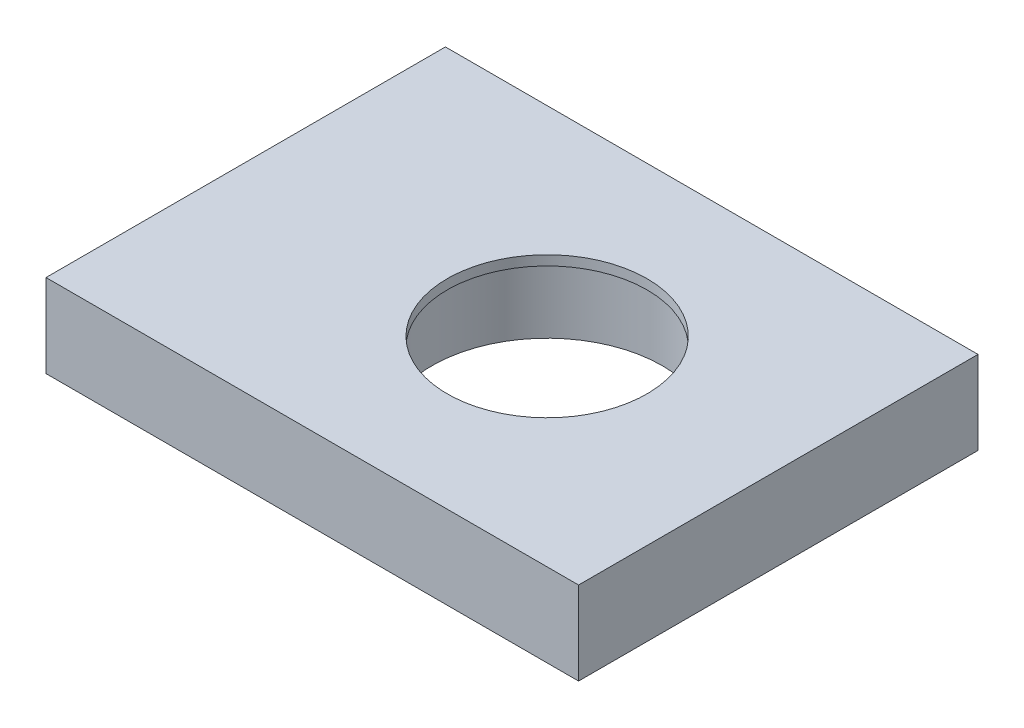
ISO-10303-21;
HEADER;
FILE_DESCRIPTION(('STEP AP214'),'2;1');
FILE_NAME('part.step','',(''),(''),'','','');
FILE_SCHEMA(('AUTOMOTIVE_DESIGN { 1 0 10303 214 1 1 1 1 }'));
ENDSEC;
DATA;
#1=APPLICATION_CONTEXT('core data for automotive mechanical design processes');
#2=APPLICATION_PROTOCOL_DEFINITION('international standard','automotive_design',2000,#1);
#3=PRODUCT_CONTEXT('',#1,'mechanical');
#4=PRODUCT('Part','Part','',(#3));
#5=PRODUCT_RELATED_PRODUCT_CATEGORY('part','',(#4));
#6=PRODUCT_DEFINITION_FORMATION('','',#4);
#7=PRODUCT_DEFINITION_CONTEXT('part definition',#1,'design');
#8=PRODUCT_DEFINITION('design','',#6,#7);
#9=PRODUCT_DEFINITION_SHAPE('','',#8);
#10=(LENGTH_UNIT() NAMED_UNIT(*) SI_UNIT(.MILLI.,.METRE.));
#11=(NAMED_UNIT(*) PLANE_ANGLE_UNIT() SI_UNIT($,.RADIAN.));
#12=(NAMED_UNIT(*) SI_UNIT($,.STERADIAN.) SOLID_ANGLE_UNIT());
#13=UNCERTAINTY_MEASURE_WITH_UNIT(LENGTH_MEASURE(1.E-05),#10,'distance_accuracy_value','');
#14=(GEOMETRIC_REPRESENTATION_CONTEXT(3) GLOBAL_UNCERTAINTY_ASSIGNED_CONTEXT((#13)) GLOBAL_UNIT_ASSIGNED_CONTEXT((#10,
#11,#12)) REPRESENTATION_CONTEXT('',''));
#15=CARTESIAN_POINT('',(0.,0.,0.));
#16=DIRECTION('',(0.,0.,1.));
#17=DIRECTION('',(1.,0.,0.));
#18=AXIS2_PLACEMENT_3D('',#15,#16,#17);
#19=CARTESIAN_POINT('',(3.35279999999999,7.9375,0.));
#20=DIRECTION('',(0.,-1.,0.));
#21=DIRECTION('',(0.,0.,-1.));
#22=AXIS2_PLACEMENT_3D('',#19,#20,#21);
#23=CYLINDRICAL_SURFACE('',#22,9.525);
#24=CARTESIAN_POINT('',(3.35279999999999,7.9375,0.));
#25=DIRECTION('',(0.,-1.,0.));
#26=DIRECTION('',(0.,0.,-1.));
#27=AXIS2_PLACEMENT_3D('',#24,#25,#26);
#28=CIRCLE('',#27,9.525);
#29=CARTESIAN_POINT('',(3.35279999999999,7.9375,-9.525));
#30=VERTEX_POINT('',#29);
#31=EDGE_CURVE('E110',#30,#30,#28,.T.);
#32=ORIENTED_EDGE('',*,*,#31,.F.);
#33=EDGE_LOOP('',(#32));
#34=FACE_BOUND('',#33,.T.);
#35=CARTESIAN_POINT('',(3.35279999999999,7.0104,0.));
#36=DIRECTION('',(0.,-1.,0.));
#37=DIRECTION('',(0.,0.,-1.));
#38=AXIS2_PLACEMENT_3D('',#35,#36,#37);
#39=CIRCLE('',#38,9.525);
#40=CARTESIAN_POINT('',(3.35279999999999,7.0104,-9.525));
#41=VERTEX_POINT('',#40);
#42=EDGE_CURVE('E45',#41,#41,#39,.F.);
#43=ORIENTED_EDGE('',*,*,#42,.F.);
#44=EDGE_LOOP('',(#43));
#45=FACE_BOUND('',#44,.T.);
#46=ADVANCED_FACE('F41',(#34,#45),#23,.F.);
#47=CARTESIAN_POINT('',(25.4,7.9375,19.05));
#48=DIRECTION('',(-1.,0.,0.));
#49=DIRECTION('',(0.,0.,1.));
#50=AXIS2_PLACEMENT_3D('',#47,#48,#49);
#51=PLANE('',#50);
#52=DIRECTION('',(0.,0.,-1.));
#53=VECTOR('',#52,1.);
#54=CARTESIAN_POINT('',(25.4,0.,19.05));
#55=LINE('',#54,#53);
#56=CARTESIAN_POINT('',(25.4,0.,19.05));
#57=VERTEX_POINT('',#56);
#58=CARTESIAN_POINT('',(25.4,0.,-19.05));
#59=VERTEX_POINT('',#58);
#60=EDGE_CURVE('E107',#57,#59,#55,.T.);
#61=ORIENTED_EDGE('',*,*,#60,.T.);
#62=DIRECTION('',(0.,-1.,0.));
#63=VECTOR('',#62,1.);
#64=CARTESIAN_POINT('',(25.4,7.9375,-19.05));
#65=LINE('',#64,#63);
#66=CARTESIAN_POINT('',(25.4,7.9375,-19.05));
#67=VERTEX_POINT('',#66);
#68=EDGE_CURVE('E11',#67,#59,#65,.T.);
#69=ORIENTED_EDGE('',*,*,#68,.F.);
#70=DIRECTION('',(0.,0.,-1.));
#71=VECTOR('',#70,1.);
#72=CARTESIAN_POINT('',(25.4,7.9375,19.05));
#73=LINE('',#72,#71);
#74=CARTESIAN_POINT('',(25.4,7.9375,19.05));
#75=VERTEX_POINT('',#74);
#76=EDGE_CURVE('E94',#75,#67,#73,.T.);
#77=ORIENTED_EDGE('',*,*,#76,.F.);
#78=DIRECTION('',(0.,-1.,0.));
#79=VECTOR('',#78,1.);
#80=CARTESIAN_POINT('',(25.4,7.9375,19.05));
#81=LINE('',#80,#79);
#82=EDGE_CURVE('E103',#75,#57,#81,.T.);
#83=ORIENTED_EDGE('',*,*,#82,.T.);
#84=EDGE_LOOP('',(#61,#69,#77,#83));
#85=FACE_BOUND('',#84,.T.);
#86=ADVANCED_FACE('F43',(#85),#51,.F.);
#87=CARTESIAN_POINT('',(-25.4,7.9375,-19.05));
#88=DIRECTION('',(0.,0.,1.));
#89=DIRECTION('',(1.,0.,0.));
#90=AXIS2_PLACEMENT_3D('',#87,#88,#89);
#91=PLANE('',#90);
#92=DIRECTION('',(-1.,0.,0.));
#93=VECTOR('',#92,1.);
#94=CARTESIAN_POINT('',(-25.4,0.,-19.05));
#95=LINE('',#94,#93);
#96=CARTESIAN_POINT('',(-25.4,0.,-19.05));
#97=VERTEX_POINT('',#96);
#98=EDGE_CURVE('E98',#59,#97,#95,.T.);
#99=ORIENTED_EDGE('',*,*,#98,.T.);
#100=DIRECTION('',(0.,-1.,0.));
#101=VECTOR('',#100,1.);
#102=CARTESIAN_POINT('',(-25.4,7.9375,-19.05));
#103=LINE('',#102,#101);
#104=CARTESIAN_POINT('',(-25.4,7.9375,-19.05));
#105=VERTEX_POINT('',#104);
#106=EDGE_CURVE('E51',#105,#97,#103,.T.);
#107=ORIENTED_EDGE('',*,*,#106,.F.);
#108=DIRECTION('',(-1.,0.,0.));
#109=VECTOR('',#108,1.);
#110=CARTESIAN_POINT('',(-25.4,7.9375,-19.05));
#111=LINE('',#110,#109);
#112=EDGE_CURVE('E89',#67,#105,#111,.T.);
#113=ORIENTED_EDGE('',*,*,#112,.F.);
#114=ORIENTED_EDGE('',*,*,#68,.T.);
#115=EDGE_LOOP('',(#99,#107,#113,#114));
#116=FACE_BOUND('',#115,.T.);
#117=ADVANCED_FACE('F97',(#116),#91,.F.);
#118=CARTESIAN_POINT('',(-25.4,7.9375,19.05));
#119=DIRECTION('',(1.,0.,0.));
#120=DIRECTION('',(0.,0.,-1.));
#121=AXIS2_PLACEMENT_3D('',#118,#119,#120);
#122=PLANE('',#121);
#123=DIRECTION('',(0.,0.,1.));
#124=VECTOR('',#123,1.);
#125=CARTESIAN_POINT('',(-25.4,0.,19.05));
#126=LINE('',#125,#124);
#127=CARTESIAN_POINT('',(-25.4,0.,19.05));
#128=VERTEX_POINT('',#127);
#129=EDGE_CURVE('E76',#97,#128,#126,.T.);
#130=ORIENTED_EDGE('',*,*,#129,.T.);
#131=DIRECTION('',(0.,-1.,0.));
#132=VECTOR('',#131,1.);
#133=CARTESIAN_POINT('',(-25.4,7.9375,19.05));
#134=LINE('',#133,#132);
#135=CARTESIAN_POINT('',(-25.4,7.9375,19.05));
#136=VERTEX_POINT('',#135);
#137=EDGE_CURVE('E99',#136,#128,#134,.T.);
#138=ORIENTED_EDGE('',*,*,#137,.F.);
#139=DIRECTION('',(0.,0.,1.));
#140=VECTOR('',#139,1.);
#141=CARTESIAN_POINT('',(-25.4,7.9375,19.05));
#142=LINE('',#141,#140);
#143=EDGE_CURVE('E92',#105,#136,#142,.T.);
#144=ORIENTED_EDGE('',*,*,#143,.F.);
#145=ORIENTED_EDGE('',*,*,#106,.T.);
#146=EDGE_LOOP('',(#130,#138,#144,#145));
#147=FACE_BOUND('',#146,.T.);
#148=ADVANCED_FACE('F101',(#147),#122,.F.);
#149=CARTESIAN_POINT('',(-25.4,7.9375,19.05));
#150=DIRECTION('',(0.,0.,-1.));
#151=DIRECTION('',(-1.,0.,0.));
#152=AXIS2_PLACEMENT_3D('',#149,#150,#151);
#153=PLANE('',#152);
#154=DIRECTION('',(1.,0.,0.));
#155=VECTOR('',#154,1.);
#156=CARTESIAN_POINT('',(-25.4,0.,19.05));
#157=LINE('',#156,#155);
#158=EDGE_CURVE('E82',#128,#57,#157,.T.);
#159=ORIENTED_EDGE('',*,*,#158,.T.);
#160=ORIENTED_EDGE('',*,*,#82,.F.);
#161=DIRECTION('',(1.,0.,0.));
#162=VECTOR('',#161,1.);
#163=CARTESIAN_POINT('',(-25.4,7.9375,19.05));
#164=LINE('',#163,#162);
#165=EDGE_CURVE('E59',#136,#75,#164,.T.);
#166=ORIENTED_EDGE('',*,*,#165,.F.);
#167=ORIENTED_EDGE('',*,*,#137,.T.);
#168=EDGE_LOOP('',(#159,#160,#166,#167));
#169=FACE_BOUND('',#168,.T.);
#170=ADVANCED_FACE('F115',(#169),#153,.F.);
#171=CARTESIAN_POINT('',(0.,7.9375,0.));
#172=DIRECTION('',(0.,-1.,0.));
#173=DIRECTION('',(0.,0.,-1.));
#174=AXIS2_PLACEMENT_3D('',#171,#172,#173);
#175=PLANE('',#174);
#176=ORIENTED_EDGE('',*,*,#31,.T.);
#177=EDGE_LOOP('',(#176));
#178=FACE_BOUND('',#177,.T.);
#179=ORIENTED_EDGE('',*,*,#76,.T.);
#180=ORIENTED_EDGE('',*,*,#112,.T.);
#181=ORIENTED_EDGE('',*,*,#143,.T.);
#182=ORIENTED_EDGE('',*,*,#165,.T.);
#183=EDGE_LOOP('',(#179,#180,#181,#182));
#184=FACE_BOUND('',#183,.T.);
#185=ADVANCED_FACE('F90',(#178,#184),#175,.F.);
#186=CARTESIAN_POINT('',(0.,0.,0.));
#187=DIRECTION('',(0.,-1.,0.));
#188=DIRECTION('',(0.,0.,-1.));
#189=AXIS2_PLACEMENT_3D('',#186,#187,#188);
#190=PLANE('',#189);
#191=CARTESIAN_POINT('',(-21.4249,0.,14.986));
#192=DIRECTION('',(0.,-1.,0.));
#193=DIRECTION('',(0.,0.,-1.));
#194=AXIS2_PLACEMENT_3D('',#191,#192,#193);
#195=CIRCLE('',#194,1.4986);
#196=CARTESIAN_POINT('',(-21.4249,0.,13.4874));
#197=VERTEX_POINT('',#196);
#198=EDGE_CURVE('E143',#197,#197,#195,.T.);
#199=ORIENTED_EDGE('',*,*,#198,.F.);
#200=EDGE_LOOP('',(#199));
#201=FACE_BOUND('',#200,.T.);
#202=CARTESIAN_POINT('',(-21.4249,0.,-4.99533333333333));
#203=DIRECTION('',(0.,-1.,0.));
#204=DIRECTION('',(0.,0.,-1.));
#205=AXIS2_PLACEMENT_3D('',#202,#203,#204);
#206=CIRCLE('',#205,1.4986);
#207=CARTESIAN_POINT('',(-21.4249,0.,-6.49393333333333));
#208=VERTEX_POINT('',#207);
#209=EDGE_CURVE('E134',#208,#208,#206,.T.);
#210=ORIENTED_EDGE('',*,*,#209,.F.);
#211=EDGE_LOOP('',(#210));
#212=FACE_BOUND('',#211,.T.);
#213=CARTESIAN_POINT('',(-21.4249,0.,-14.986));
#214=DIRECTION('',(0.,-1.,0.));
#215=DIRECTION('',(0.,0.,-1.));
#216=AXIS2_PLACEMENT_3D('',#213,#214,#215);
#217=CIRCLE('',#216,1.4986);
#218=CARTESIAN_POINT('',(-21.4249,0.,-16.4846));
#219=VERTEX_POINT('',#218);
#220=EDGE_CURVE('E133',#219,#219,#217,.T.);
#221=ORIENTED_EDGE('',*,*,#220,.F.);
#222=EDGE_LOOP('',(#221));
#223=FACE_BOUND('',#222,.T.);
#224=CARTESIAN_POINT('',(-21.4249,0.,4.99533333333334));
#225=DIRECTION('',(0.,-1.,0.));
#226=DIRECTION('',(0.,0.,-1.));
#227=AXIS2_PLACEMENT_3D('',#224,#225,#226);
#228=CIRCLE('',#227,1.4986);
#229=CARTESIAN_POINT('',(-21.4249,0.,3.49673333333334));
#230=VERTEX_POINT('',#229);
#231=EDGE_CURVE('E140',#230,#230,#228,.T.);
#232=ORIENTED_EDGE('',*,*,#231,.F.);
#233=EDGE_LOOP('',(#232));
#234=FACE_BOUND('',#233,.T.);
#235=CARTESIAN_POINT('',(3.35279999999999,0.,0.));
#236=DIRECTION('',(0.,-1.,0.));
#237=DIRECTION('',(0.,0.,-1.));
#238=AXIS2_PLACEMENT_3D('',#235,#236,#237);
#239=CIRCLE('',#238,10.9982);
#240=CARTESIAN_POINT('',(3.35279999999999,0.,-10.9982));
#241=VERTEX_POINT('',#240);
#242=EDGE_CURVE('E123',#241,#241,#239,.T.);
#243=ORIENTED_EDGE('',*,*,#242,.F.);
#244=EDGE_LOOP('',(#243));
#245=FACE_BOUND('',#244,.T.);
#246=ORIENTED_EDGE('',*,*,#60,.F.);
#247=ORIENTED_EDGE('',*,*,#158,.F.);
#248=ORIENTED_EDGE('',*,*,#129,.F.);
#249=ORIENTED_EDGE('',*,*,#98,.F.);
#250=EDGE_LOOP('',(#246,#247,#248,#249));
#251=FACE_BOUND('',#250,.T.);
#252=ADVANCED_FACE('F118',(#201,#212,#223,#234,#245,#251),#190,.T.);
#253=CARTESIAN_POINT('',(3.35279999999999,7.0104,0.));
#254=DIRECTION('',(0.,-1.,0.));
#255=DIRECTION('',(0.,0.,-1.));
#256=AXIS2_PLACEMENT_3D('',#253,#254,#255);
#257=PLANE('',#256);
#258=CARTESIAN_POINT('',(3.35279999999999,7.0104,0.));
#259=DIRECTION('',(0.,-1.,0.));
#260=DIRECTION('',(0.,0.,-1.));
#261=AXIS2_PLACEMENT_3D('',#258,#259,#260);
#262=CIRCLE('',#261,10.9982);
#263=CARTESIAN_POINT('',(3.35279999999999,7.0104,-10.9982));
#264=VERTEX_POINT('',#263);
#265=EDGE_CURVE('E126',#264,#264,#262,.T.);
#266=ORIENTED_EDGE('',*,*,#265,.T.);
#267=EDGE_LOOP('',(#266));
#268=FACE_BOUND('',#267,.T.);
#269=ORIENTED_EDGE('',*,*,#42,.T.);
#270=EDGE_LOOP('',(#269));
#271=FACE_BOUND('',#270,.T.);
#272=ADVANCED_FACE('F165',(#268,#271),#257,.T.);
#273=CARTESIAN_POINT('',(3.35279999999999,7.0104,0.));
#274=DIRECTION('',(0.,-1.,0.));
#275=DIRECTION('',(0.,0.,-1.));
#276=AXIS2_PLACEMENT_3D('',#273,#274,#275);
#277=CYLINDRICAL_SURFACE('',#276,10.9982);
#278=ORIENTED_EDGE('',*,*,#265,.F.);
#279=EDGE_LOOP('',(#278));
#280=FACE_BOUND('',#279,.T.);
#281=ORIENTED_EDGE('',*,*,#242,.T.);
#282=EDGE_LOOP('',(#281));
#283=FACE_BOUND('',#282,.T.);
#284=ADVANCED_FACE('F175',(#280,#283),#277,.F.);
#285=CARTESIAN_POINT('',(-21.4249,6.5,4.99533333333334));
#286=DIRECTION('',(0.,-1.,0.));
#287=DIRECTION('',(0.,0.,-1.));
#288=AXIS2_PLACEMENT_3D('',#285,#286,#287);
#289=CYLINDRICAL_SURFACE('',#288,1.4986);
#290=CARTESIAN_POINT('',(-21.4249,6.5,4.99533333333334));
#291=DIRECTION('',(0.,-1.,0.));
#292=DIRECTION('',(0.,0.,-1.));
#293=AXIS2_PLACEMENT_3D('',#290,#291,#292);
#294=CIRCLE('',#293,1.4986);
#295=CARTESIAN_POINT('',(-21.4249,6.5,3.49673333333334));
#296=VERTEX_POINT('',#295);
#297=EDGE_CURVE('E137',#296,#296,#294,.T.);
#298=CARTESIAN_POINT('',(-21.4249,6.5,3.49673333333334));
#299=CARTESIAN_POINT('',(-21.4249,6.43229166666667,3.49673333333334));
#300=CARTESIAN_POINT('',(-21.4249,6.36458333333333,3.49673333333334));
#301=CARTESIAN_POINT('',(-21.4249,6.22916666666667,3.49673333333334));
#302=CARTESIAN_POINT('',(-21.4249,6.16145833333333,3.49673333333334));
#303=CARTESIAN_POINT('',(-21.4249,6.02604166666667,3.49673333333334));
#304=CARTESIAN_POINT('',(-21.4249,5.95833333333333,3.49673333333334));
#305=CARTESIAN_POINT('',(-21.4249,5.82291666666667,3.49673333333334));
#306=CARTESIAN_POINT('',(-21.4249,5.75520833333333,3.49673333333334));
#307=CARTESIAN_POINT('',(-21.4249,5.61979166666667,3.49673333333334));
#308=CARTESIAN_POINT('',(-21.4249,5.55208333333333,3.49673333333334));
#309=CARTESIAN_POINT('',(-21.4249,5.41666666666667,3.49673333333334));
#310=CARTESIAN_POINT('',(-21.4249,5.34895833333333,3.49673333333334));
#311=CARTESIAN_POINT('',(-21.4249,5.21354166666667,3.49673333333334));
#312=CARTESIAN_POINT('',(-21.4249,5.14583333333333,3.49673333333334));
#313=CARTESIAN_POINT('',(-21.4249,5.01041666666667,3.49673333333334));
#314=CARTESIAN_POINT('',(-21.4249,4.94270833333333,3.49673333333334));
#315=CARTESIAN_POINT('',(-21.4249,4.80729166666667,3.49673333333334));
#316=CARTESIAN_POINT('',(-21.4249,4.73958333333333,3.49673333333334));
#317=CARTESIAN_POINT('',(-21.4249,4.60416666666667,3.49673333333334));
#318=CARTESIAN_POINT('',(-21.4249,4.53645833333333,3.49673333333334));
#319=CARTESIAN_POINT('',(-21.4249,4.40104166666667,3.49673333333334));
#320=CARTESIAN_POINT('',(-21.4249,4.33333333333333,3.49673333333334));
#321=CARTESIAN_POINT('',(-21.4249,4.19791666666667,3.49673333333334));
#322=CARTESIAN_POINT('',(-21.4249,4.13020833333333,3.49673333333334));
#323=CARTESIAN_POINT('',(-21.4249,3.99479166666667,3.49673333333334));
#324=CARTESIAN_POINT('',(-21.4249,3.92708333333333,3.49673333333334));
#325=CARTESIAN_POINT('',(-21.4249,3.79166666666667,3.49673333333334));
#326=CARTESIAN_POINT('',(-21.4249,3.72395833333333,3.49673333333334));
#327=CARTESIAN_POINT('',(-21.4249,3.58854166666667,3.49673333333334));
#328=CARTESIAN_POINT('',(-21.4249,3.52083333333333,3.49673333333334));
#329=CARTESIAN_POINT('',(-21.4249,3.38541666666667,3.49673333333334));
#330=CARTESIAN_POINT('',(-21.4249,3.31770833333333,3.49673333333334));
#331=CARTESIAN_POINT('',(-21.4249,3.18229166666667,3.49673333333334));
#332=CARTESIAN_POINT('',(-21.4249,3.11458333333333,3.49673333333334));
#333=CARTESIAN_POINT('',(-21.4249,2.97916666666667,3.49673333333334));
#334=CARTESIAN_POINT('',(-21.4249,2.91145833333333,3.49673333333334));
#335=CARTESIAN_POINT('',(-21.4249,2.77604166666667,3.49673333333334));
#336=CARTESIAN_POINT('',(-21.4249,2.70833333333333,3.49673333333334));
#337=CARTESIAN_POINT('',(-21.4249,2.57291666666667,3.49673333333334));
#338=CARTESIAN_POINT('',(-21.4249,2.50520833333333,3.49673333333334));
#339=CARTESIAN_POINT('',(-21.4249,2.36979166666667,3.49673333333334));
#340=CARTESIAN_POINT('',(-21.4249,2.30208333333333,3.49673333333334));
#341=CARTESIAN_POINT('',(-21.4249,2.16666666666667,3.49673333333334));
#342=CARTESIAN_POINT('',(-21.4249,2.09895833333333,3.49673333333334));
#343=CARTESIAN_POINT('',(-21.4249,1.96354166666667,3.49673333333334));
#344=CARTESIAN_POINT('',(-21.4249,1.89583333333333,3.49673333333334));
#345=CARTESIAN_POINT('',(-21.4249,1.76041666666667,3.49673333333334));
#346=CARTESIAN_POINT('',(-21.4249,1.69270833333333,3.49673333333334));
#347=CARTESIAN_POINT('',(-21.4249,1.55729166666667,3.49673333333334));
#348=CARTESIAN_POINT('',(-21.4249,1.48958333333333,3.49673333333334));
#349=CARTESIAN_POINT('',(-21.4249,1.35416666666667,3.49673333333334));
#350=CARTESIAN_POINT('',(-21.4249,1.28645833333333,3.49673333333334));
#351=CARTESIAN_POINT('',(-21.4249,1.15104166666667,3.49673333333334));
#352=CARTESIAN_POINT('',(-21.4249,1.08333333333333,3.49673333333334));
#353=CARTESIAN_POINT('',(-21.4249,0.947916666666667,3.49673333333334));
#354=CARTESIAN_POINT('',(-21.4249,0.880208333333333,3.49673333333334));
#355=CARTESIAN_POINT('',(-21.4249,0.744791666666667,3.49673333333334));
#356=CARTESIAN_POINT('',(-21.4249,0.677083333333334,3.49673333333334));
#357=CARTESIAN_POINT('',(-21.4249,0.541666666666667,3.49673333333334));
#358=CARTESIAN_POINT('',(-21.4249,0.473958333333334,3.49673333333334));
#359=CARTESIAN_POINT('',(-21.4249,0.338541666666667,3.49673333333334));
#360=CARTESIAN_POINT('',(-21.4249,0.270833333333334,3.49673333333334));
#361=CARTESIAN_POINT('',(-21.4249,0.135416666666667,3.49673333333334));
#362=CARTESIAN_POINT('',(-21.4249,0.0677083333333333,3.49673333333334));
#363=CARTESIAN_POINT('',(-21.4249,0.,3.49673333333334));
#364=B_SPLINE_CURVE_WITH_KNOTS('',3,(#298,#299,#300,#301,#302,#303,#304,#305,#306,#307,#308,
#309,#310,#311,#312,#313,#314,#315,#316,#317,#318,#319,#320,#321,#322,#323,#324,#325,#326,#327,
#328,#329,#330,#331,#332,#333,#334,#335,#336,#337,#338,#339,#340,#341,#342,#343,#344,#345,#346,
#347,#348,#349,#350,#351,#352,#353,#354,#355,#356,#357,#358,#359,#360,#361,#362,#363),
.UNSPECIFIED.,.F.,.F.,(4,2,2,2,2,2,2,2,2,2,2,2,2,2,2,2,2,2,2,2,2,2,2,2,2,2,2,2,2,2,2,2,4),(0.,
0.203125,0.40625,0.609375000000001,0.812500000000001,1.015625,1.21875,1.421875,1.625,1.828125,
2.03125,2.234375,2.4375,2.640625,2.84375,3.046875,3.25,3.453125,3.65625,3.859375,4.0625,
4.265625,4.46875,4.671875,4.875,5.078125,5.28125,5.484375,5.6875,5.890625,6.09375,6.296875,6.5),.UNSPECIFIED.);
#365=EDGE_CURVE('BSEAM177',#296,#230,#364,.T.);
#366=ORIENTED_EDGE('',*,*,#297,.F.);
#367=ORIENTED_EDGE('',*,*,#231,.T.);
#368=ORIENTED_EDGE('',*,*,#365,.T.);
#369=ORIENTED_EDGE('',*,*,#365,.F.);
#370=EDGE_LOOP('',(#366,#368,#367,#369));
#371=FACE_BOUND('',#370,.T.);
#372=ADVANCED_FACE('F177',(#371),#289,.F.);
#373=CARTESIAN_POINT('',(-21.4249,6.5,4.99533333333334));
#374=DIRECTION('',(0.,-1.,0.));
#375=DIRECTION('',(0.,0.,-1.));
#376=AXIS2_PLACEMENT_3D('',#373,#374,#375);
#377=PLANE('',#376);
#378=ORIENTED_EDGE('',*,*,#297,.T.);
#379=EDGE_LOOP('',(#378));
#380=FACE_BOUND('',#379,.T.);
#381=ADVANCED_FACE('F184',(#380),#377,.T.);
#382=CARTESIAN_POINT('',(-21.4249,6.5,-14.986));
#383=DIRECTION('',(0.,-1.,0.));
#384=DIRECTION('',(0.,0.,-1.));
#385=AXIS2_PLACEMENT_3D('',#382,#383,#384);
#386=CYLINDRICAL_SURFACE('',#385,1.4986);
#387=CARTESIAN_POINT('',(-21.4249,6.5,-14.986));
#388=DIRECTION('',(0.,-1.,0.));
#389=DIRECTION('',(0.,0.,-1.));
#390=AXIS2_PLACEMENT_3D('',#387,#388,#389);
#391=CIRCLE('',#390,1.4986);
#392=CARTESIAN_POINT('',(-21.4249,6.5,-16.4846));
#393=VERTEX_POINT('',#392);
#394=EDGE_CURVE('E130',#393,#393,#391,.T.);
#395=CARTESIAN_POINT('',(-21.4249,6.5,-16.4846));
#396=CARTESIAN_POINT('',(-21.4249,6.43229166666667,-16.4846));
#397=CARTESIAN_POINT('',(-21.4249,6.36458333333333,-16.4846));
#398=CARTESIAN_POINT('',(-21.4249,6.22916666666667,-16.4846));
#399=CARTESIAN_POINT('',(-21.4249,6.16145833333333,-16.4846));
#400=CARTESIAN_POINT('',(-21.4249,6.02604166666667,-16.4846));
#401=CARTESIAN_POINT('',(-21.4249,5.95833333333333,-16.4846));
#402=CARTESIAN_POINT('',(-21.4249,5.82291666666667,-16.4846));
#403=CARTESIAN_POINT('',(-21.4249,5.75520833333333,-16.4846));
#404=CARTESIAN_POINT('',(-21.4249,5.61979166666667,-16.4846));
#405=CARTESIAN_POINT('',(-21.4249,5.55208333333333,-16.4846));
#406=CARTESIAN_POINT('',(-21.4249,5.41666666666667,-16.4846));
#407=CARTESIAN_POINT('',(-21.4249,5.34895833333333,-16.4846));
#408=CARTESIAN_POINT('',(-21.4249,5.21354166666667,-16.4846));
#409=CARTESIAN_POINT('',(-21.4249,5.14583333333333,-16.4846));
#410=CARTESIAN_POINT('',(-21.4249,5.01041666666667,-16.4846));
#411=CARTESIAN_POINT('',(-21.4249,4.94270833333333,-16.4846));
#412=CARTESIAN_POINT('',(-21.4249,4.80729166666667,-16.4846));
#413=CARTESIAN_POINT('',(-21.4249,4.73958333333333,-16.4846));
#414=CARTESIAN_POINT('',(-21.4249,4.60416666666667,-16.4846));
#415=CARTESIAN_POINT('',(-21.4249,4.53645833333333,-16.4846));
#416=CARTESIAN_POINT('',(-21.4249,4.40104166666667,-16.4846));
#417=CARTESIAN_POINT('',(-21.4249,4.33333333333333,-16.4846));
#418=CARTESIAN_POINT('',(-21.4249,4.19791666666667,-16.4846));
#419=CARTESIAN_POINT('',(-21.4249,4.13020833333333,-16.4846));
#420=CARTESIAN_POINT('',(-21.4249,3.99479166666667,-16.4846));
#421=CARTESIAN_POINT('',(-21.4249,3.92708333333333,-16.4846));
#422=CARTESIAN_POINT('',(-21.4249,3.79166666666667,-16.4846));
#423=CARTESIAN_POINT('',(-21.4249,3.72395833333333,-16.4846));
#424=CARTESIAN_POINT('',(-21.4249,3.58854166666667,-16.4846));
#425=CARTESIAN_POINT('',(-21.4249,3.52083333333333,-16.4846));
#426=CARTESIAN_POINT('',(-21.4249,3.38541666666667,-16.4846));
#427=CARTESIAN_POINT('',(-21.4249,3.31770833333333,-16.4846));
#428=CARTESIAN_POINT('',(-21.4249,3.18229166666667,-16.4846));
#429=CARTESIAN_POINT('',(-21.4249,3.11458333333333,-16.4846));
#430=CARTESIAN_POINT('',(-21.4249,2.97916666666667,-16.4846));
#431=CARTESIAN_POINT('',(-21.4249,2.91145833333333,-16.4846));
#432=CARTESIAN_POINT('',(-21.4249,2.77604166666667,-16.4846));
#433=CARTESIAN_POINT('',(-21.4249,2.70833333333333,-16.4846));
#434=CARTESIAN_POINT('',(-21.4249,2.57291666666667,-16.4846));
#435=CARTESIAN_POINT('',(-21.4249,2.50520833333333,-16.4846));
#436=CARTESIAN_POINT('',(-21.4249,2.36979166666667,-16.4846));
#437=CARTESIAN_POINT('',(-21.4249,2.30208333333333,-16.4846));
#438=CARTESIAN_POINT('',(-21.4249,2.16666666666667,-16.4846));
#439=CARTESIAN_POINT('',(-21.4249,2.09895833333333,-16.4846));
#440=CARTESIAN_POINT('',(-21.4249,1.96354166666667,-16.4846));
#441=CARTESIAN_POINT('',(-21.4249,1.89583333333333,-16.4846));
#442=CARTESIAN_POINT('',(-21.4249,1.76041666666667,-16.4846));
#443=CARTESIAN_POINT('',(-21.4249,1.69270833333333,-16.4846));
#444=CARTESIAN_POINT('',(-21.4249,1.55729166666667,-16.4846));
#445=CARTESIAN_POINT('',(-21.4249,1.48958333333333,-16.4846));
#446=CARTESIAN_POINT('',(-21.4249,1.35416666666667,-16.4846));
#447=CARTESIAN_POINT('',(-21.4249,1.28645833333333,-16.4846));
#448=CARTESIAN_POINT('',(-21.4249,1.15104166666667,-16.4846));
#449=CARTESIAN_POINT('',(-21.4249,1.08333333333333,-16.4846));
#450=CARTESIAN_POINT('',(-21.4249,0.947916666666667,-16.4846));
#451=CARTESIAN_POINT('',(-21.4249,0.880208333333333,-16.4846));
#452=CARTESIAN_POINT('',(-21.4249,0.744791666666667,-16.4846));
#453=CARTESIAN_POINT('',(-21.4249,0.677083333333334,-16.4846));
#454=CARTESIAN_POINT('',(-21.4249,0.541666666666667,-16.4846));
#455=CARTESIAN_POINT('',(-21.4249,0.473958333333334,-16.4846));
#456=CARTESIAN_POINT('',(-21.4249,0.338541666666667,-16.4846));
#457=CARTESIAN_POINT('',(-21.4249,0.270833333333334,-16.4846));
#458=CARTESIAN_POINT('',(-21.4249,0.135416666666667,-16.4846));
#459=CARTESIAN_POINT('',(-21.4249,0.0677083333333333,-16.4846));
#460=CARTESIAN_POINT('',(-21.4249,0.,-16.4846));
#461=B_SPLINE_CURVE_WITH_KNOTS('',3,(#395,#396,#397,#398,#399,#400,#401,#402,#403,#404,#405,
#406,#407,#408,#409,#410,#411,#412,#413,#414,#415,#416,#417,#418,#419,#420,#421,#422,#423,#424,
#425,#426,#427,#428,#429,#430,#431,#432,#433,#434,#435,#436,#437,#438,#439,#440,#441,#442,#443,
#444,#445,#446,#447,#448,#449,#450,#451,#452,#453,#454,#455,#456,#457,#458,#459,#460),
.UNSPECIFIED.,.F.,.F.,(4,2,2,2,2,2,2,2,2,2,2,2,2,2,2,2,2,2,2,2,2,2,2,2,2,2,2,2,2,2,2,2,4),(0.,
0.203125,0.40625,0.609375000000001,0.812500000000001,1.015625,1.21875,1.421875,1.625,1.828125,
2.03125,2.234375,2.4375,2.640625,2.84375,3.046875,3.25,3.453125,3.65625,3.859375,4.0625,
4.265625,4.46875,4.671875,4.875,5.078125,5.28125,5.484375,5.6875,5.890625,6.09375,6.296875,6.5),.UNSPECIFIED.);
#462=EDGE_CURVE('BSEAM261',#393,#219,#461,.T.);
#463=ORIENTED_EDGE('',*,*,#394,.F.);
#464=ORIENTED_EDGE('',*,*,#220,.T.);
#465=ORIENTED_EDGE('',*,*,#462,.T.);
#466=ORIENTED_EDGE('',*,*,#462,.F.);
#467=EDGE_LOOP('',(#463,#465,#464,#466));
#468=FACE_BOUND('',#467,.T.);
#469=ADVANCED_FACE('F261',(#468),#386,.F.);
#470=CARTESIAN_POINT('',(-21.4249,6.5,-14.986));
#471=DIRECTION('',(0.,-1.,0.));
#472=DIRECTION('',(0.,0.,-1.));
#473=AXIS2_PLACEMENT_3D('',#470,#471,#472);
#474=PLANE('',#473);
#475=ORIENTED_EDGE('',*,*,#394,.T.);
#476=EDGE_LOOP('',(#475));
#477=FACE_BOUND('',#476,.T.);
#478=ADVANCED_FACE('F271',(#477),#474,.T.);
#479=CARTESIAN_POINT('',(-21.4249,6.5,-4.99533333333333));
#480=DIRECTION('',(0.,-1.,0.));
#481=DIRECTION('',(0.,0.,-1.));
#482=AXIS2_PLACEMENT_3D('',#479,#480,#481);
#483=CYLINDRICAL_SURFACE('',#482,1.4986);
#484=CARTESIAN_POINT('',(-21.4249,6.5,-4.99533333333333));
#485=DIRECTION('',(0.,-1.,0.));
#486=DIRECTION('',(0.,0.,-1.));
#487=AXIS2_PLACEMENT_3D('',#484,#485,#486);
#488=CIRCLE('',#487,1.4986);
#489=CARTESIAN_POINT('',(-21.4249,6.5,-6.49393333333333));
#490=VERTEX_POINT('',#489);
#491=EDGE_CURVE('E144',#490,#490,#488,.T.);
#492=CARTESIAN_POINT('',(-21.4249,6.5,-6.49393333333333));
#493=CARTESIAN_POINT('',(-21.4249,6.43229166666667,-6.49393333333333));
#494=CARTESIAN_POINT('',(-21.4249,6.36458333333333,-6.49393333333333));
#495=CARTESIAN_POINT('',(-21.4249,6.22916666666667,-6.49393333333333));
#496=CARTESIAN_POINT('',(-21.4249,6.16145833333333,-6.49393333333333));
#497=CARTESIAN_POINT('',(-21.4249,6.02604166666667,-6.49393333333333));
#498=CARTESIAN_POINT('',(-21.4249,5.95833333333333,-6.49393333333333));
#499=CARTESIAN_POINT('',(-21.4249,5.82291666666667,-6.49393333333333));
#500=CARTESIAN_POINT('',(-21.4249,5.75520833333333,-6.49393333333333));
#501=CARTESIAN_POINT('',(-21.4249,5.61979166666667,-6.49393333333333));
#502=CARTESIAN_POINT('',(-21.4249,5.55208333333333,-6.49393333333333));
#503=CARTESIAN_POINT('',(-21.4249,5.41666666666667,-6.49393333333333));
#504=CARTESIAN_POINT('',(-21.4249,5.34895833333333,-6.49393333333333));
#505=CARTESIAN_POINT('',(-21.4249,5.21354166666667,-6.49393333333333));
#506=CARTESIAN_POINT('',(-21.4249,5.14583333333333,-6.49393333333333));
#507=CARTESIAN_POINT('',(-21.4249,5.01041666666667,-6.49393333333333));
#508=CARTESIAN_POINT('',(-21.4249,4.94270833333333,-6.49393333333333));
#509=CARTESIAN_POINT('',(-21.4249,4.80729166666667,-6.49393333333333));
#510=CARTESIAN_POINT('',(-21.4249,4.73958333333333,-6.49393333333333));
#511=CARTESIAN_POINT('',(-21.4249,4.60416666666667,-6.49393333333333));
#512=CARTESIAN_POINT('',(-21.4249,4.53645833333333,-6.49393333333333));
#513=CARTESIAN_POINT('',(-21.4249,4.40104166666667,-6.49393333333333));
#514=CARTESIAN_POINT('',(-21.4249,4.33333333333333,-6.49393333333333));
#515=CARTESIAN_POINT('',(-21.4249,4.19791666666667,-6.49393333333333));
#516=CARTESIAN_POINT('',(-21.4249,4.13020833333333,-6.49393333333333));
#517=CARTESIAN_POINT('',(-21.4249,3.99479166666667,-6.49393333333333));
#518=CARTESIAN_POINT('',(-21.4249,3.92708333333333,-6.49393333333333));
#519=CARTESIAN_POINT('',(-21.4249,3.79166666666667,-6.49393333333333));
#520=CARTESIAN_POINT('',(-21.4249,3.72395833333333,-6.49393333333333));
#521=CARTESIAN_POINT('',(-21.4249,3.58854166666667,-6.49393333333333));
#522=CARTESIAN_POINT('',(-21.4249,3.52083333333333,-6.49393333333333));
#523=CARTESIAN_POINT('',(-21.4249,3.38541666666667,-6.49393333333333));
#524=CARTESIAN_POINT('',(-21.4249,3.31770833333333,-6.49393333333333));
#525=CARTESIAN_POINT('',(-21.4249,3.18229166666667,-6.49393333333333));
#526=CARTESIAN_POINT('',(-21.4249,3.11458333333333,-6.49393333333333));
#527=CARTESIAN_POINT('',(-21.4249,2.97916666666667,-6.49393333333333));
#528=CARTESIAN_POINT('',(-21.4249,2.91145833333333,-6.49393333333333));
#529=CARTESIAN_POINT('',(-21.4249,2.77604166666667,-6.49393333333333));
#530=CARTESIAN_POINT('',(-21.4249,2.70833333333333,-6.49393333333333));
#531=CARTESIAN_POINT('',(-21.4249,2.57291666666667,-6.49393333333333));
#532=CARTESIAN_POINT('',(-21.4249,2.50520833333333,-6.49393333333333));
#533=CARTESIAN_POINT('',(-21.4249,2.36979166666667,-6.49393333333333));
#534=CARTESIAN_POINT('',(-21.4249,2.30208333333333,-6.49393333333333));
#535=CARTESIAN_POINT('',(-21.4249,2.16666666666667,-6.49393333333333));
#536=CARTESIAN_POINT('',(-21.4249,2.09895833333333,-6.49393333333333));
#537=CARTESIAN_POINT('',(-21.4249,1.96354166666667,-6.49393333333333));
#538=CARTESIAN_POINT('',(-21.4249,1.89583333333333,-6.49393333333333));
#539=CARTESIAN_POINT('',(-21.4249,1.76041666666667,-6.49393333333333));
#540=CARTESIAN_POINT('',(-21.4249,1.69270833333333,-6.49393333333333));
#541=CARTESIAN_POINT('',(-21.4249,1.55729166666667,-6.49393333333333));
#542=CARTESIAN_POINT('',(-21.4249,1.48958333333333,-6.49393333333333));
#543=CARTESIAN_POINT('',(-21.4249,1.35416666666667,-6.49393333333333));
#544=CARTESIAN_POINT('',(-21.4249,1.28645833333333,-6.49393333333333));
#545=CARTESIAN_POINT('',(-21.4249,1.15104166666667,-6.49393333333333));
#546=CARTESIAN_POINT('',(-21.4249,1.08333333333333,-6.49393333333333));
#547=CARTESIAN_POINT('',(-21.4249,0.947916666666667,-6.49393333333333));
#548=CARTESIAN_POINT('',(-21.4249,0.880208333333333,-6.49393333333333));
#549=CARTESIAN_POINT('',(-21.4249,0.744791666666667,-6.49393333333333));
#550=CARTESIAN_POINT('',(-21.4249,0.677083333333334,-6.49393333333333));
#551=CARTESIAN_POINT('',(-21.4249,0.541666666666667,-6.49393333333333));
#552=CARTESIAN_POINT('',(-21.4249,0.473958333333334,-6.49393333333333));
#553=CARTESIAN_POINT('',(-21.4249,0.338541666666667,-6.49393333333333));
#554=CARTESIAN_POINT('',(-21.4249,0.270833333333334,-6.49393333333333));
#555=CARTESIAN_POINT('',(-21.4249,0.135416666666667,-6.49393333333333));
#556=CARTESIAN_POINT('',(-21.4249,0.0677083333333333,-6.49393333333333));
#557=CARTESIAN_POINT('',(-21.4249,0.,-6.49393333333333));
#558=B_SPLINE_CURVE_WITH_KNOTS('',3,(#492,#493,#494,#495,#496,#497,#498,#499,#500,#501,#502,
#503,#504,#505,#506,#507,#508,#509,#510,#511,#512,#513,#514,#515,#516,#517,#518,#519,#520,#521,
#522,#523,#524,#525,#526,#527,#528,#529,#530,#531,#532,#533,#534,#535,#536,#537,#538,#539,#540,
#541,#542,#543,#544,#545,#546,#547,#548,#549,#550,#551,#552,#553,#554,#555,#556,#557),
.UNSPECIFIED.,.F.,.F.,(4,2,2,2,2,2,2,2,2,2,2,2,2,2,2,2,2,2,2,2,2,2,2,2,2,2,2,2,2,2,2,2,4),(0.,
0.203125,0.40625,0.609375000000001,0.812500000000001,1.015625,1.21875,1.421875,1.625,1.828125,
2.03125,2.234375,2.4375,2.640625,2.84375,3.046875,3.25,3.453125,3.65625,3.859375,4.0625,
4.265625,4.46875,4.671875,4.875,5.078125,5.28125,5.484375,5.6875,5.890625,6.09375,6.296875,6.5),.UNSPECIFIED.);
#559=EDGE_CURVE('BSEAM281',#490,#208,#558,.T.);
#560=ORIENTED_EDGE('',*,*,#491,.F.);
#561=ORIENTED_EDGE('',*,*,#209,.T.);
#562=ORIENTED_EDGE('',*,*,#559,.T.);
#563=ORIENTED_EDGE('',*,*,#559,.F.);
#564=EDGE_LOOP('',(#560,#562,#561,#563));
#565=FACE_BOUND('',#564,.T.);
#566=ADVANCED_FACE('F281',(#565),#483,.F.);
#567=CARTESIAN_POINT('',(-21.4249,6.5,-4.99533333333333));
#568=DIRECTION('',(0.,-1.,0.));
#569=DIRECTION('',(0.,0.,-1.));
#570=AXIS2_PLACEMENT_3D('',#567,#568,#569);
#571=PLANE('',#570);
#572=ORIENTED_EDGE('',*,*,#491,.T.);
#573=EDGE_LOOP('',(#572));
#574=FACE_BOUND('',#573,.T.);
#575=ADVANCED_FACE('F159',(#574),#571,.T.);
#576=CARTESIAN_POINT('',(-21.4249,6.5,14.986));
#577=DIRECTION('',(0.,-1.,0.));
#578=DIRECTION('',(0.,0.,-1.));
#579=AXIS2_PLACEMENT_3D('',#576,#577,#578);
#580=CYLINDRICAL_SURFACE('',#579,1.4986);
#581=CARTESIAN_POINT('',(-21.4249,6.5,14.986));
#582=DIRECTION('',(0.,-1.,0.));
#583=DIRECTION('',(0.,0.,-1.));
#584=AXIS2_PLACEMENT_3D('',#581,#582,#583);
#585=CIRCLE('',#584,1.4986);
#586=CARTESIAN_POINT('',(-21.4249,6.5,13.4874));
#587=VERTEX_POINT('',#586);
#588=EDGE_CURVE('E127',#587,#587,#585,.T.);
#589=CARTESIAN_POINT('',(-21.4249,6.5,13.4874));
#590=CARTESIAN_POINT('',(-21.4249,6.43229166666667,13.4874));
#591=CARTESIAN_POINT('',(-21.4249,6.36458333333333,13.4874));
#592=CARTESIAN_POINT('',(-21.4249,6.22916666666667,13.4874));
#593=CARTESIAN_POINT('',(-21.4249,6.16145833333333,13.4874));
#594=CARTESIAN_POINT('',(-21.4249,6.02604166666667,13.4874));
#595=CARTESIAN_POINT('',(-21.4249,5.95833333333333,13.4874));
#596=CARTESIAN_POINT('',(-21.4249,5.82291666666667,13.4874));
#597=CARTESIAN_POINT('',(-21.4249,5.75520833333333,13.4874));
#598=CARTESIAN_POINT('',(-21.4249,5.61979166666667,13.4874));
#599=CARTESIAN_POINT('',(-21.4249,5.55208333333333,13.4874));
#600=CARTESIAN_POINT('',(-21.4249,5.41666666666667,13.4874));
#601=CARTESIAN_POINT('',(-21.4249,5.34895833333333,13.4874));
#602=CARTESIAN_POINT('',(-21.4249,5.21354166666667,13.4874));
#603=CARTESIAN_POINT('',(-21.4249,5.14583333333333,13.4874));
#604=CARTESIAN_POINT('',(-21.4249,5.01041666666667,13.4874));
#605=CARTESIAN_POINT('',(-21.4249,4.94270833333333,13.4874));
#606=CARTESIAN_POINT('',(-21.4249,4.80729166666667,13.4874));
#607=CARTESIAN_POINT('',(-21.4249,4.73958333333333,13.4874));
#608=CARTESIAN_POINT('',(-21.4249,4.60416666666667,13.4874));
#609=CARTESIAN_POINT('',(-21.4249,4.53645833333333,13.4874));
#610=CARTESIAN_POINT('',(-21.4249,4.40104166666667,13.4874));
#611=CARTESIAN_POINT('',(-21.4249,4.33333333333333,13.4874));
#612=CARTESIAN_POINT('',(-21.4249,4.19791666666667,13.4874));
#613=CARTESIAN_POINT('',(-21.4249,4.13020833333333,13.4874));
#614=CARTESIAN_POINT('',(-21.4249,3.99479166666667,13.4874));
#615=CARTESIAN_POINT('',(-21.4249,3.92708333333333,13.4874));
#616=CARTESIAN_POINT('',(-21.4249,3.79166666666667,13.4874));
#617=CARTESIAN_POINT('',(-21.4249,3.72395833333333,13.4874));
#618=CARTESIAN_POINT('',(-21.4249,3.58854166666667,13.4874));
#619=CARTESIAN_POINT('',(-21.4249,3.52083333333333,13.4874));
#620=CARTESIAN_POINT('',(-21.4249,3.38541666666667,13.4874));
#621=CARTESIAN_POINT('',(-21.4249,3.31770833333333,13.4874));
#622=CARTESIAN_POINT('',(-21.4249,3.18229166666667,13.4874));
#623=CARTESIAN_POINT('',(-21.4249,3.11458333333333,13.4874));
#624=CARTESIAN_POINT('',(-21.4249,2.97916666666667,13.4874));
#625=CARTESIAN_POINT('',(-21.4249,2.91145833333333,13.4874));
#626=CARTESIAN_POINT('',(-21.4249,2.77604166666667,13.4874));
#627=CARTESIAN_POINT('',(-21.4249,2.70833333333333,13.4874));
#628=CARTESIAN_POINT('',(-21.4249,2.57291666666667,13.4874));
#629=CARTESIAN_POINT('',(-21.4249,2.50520833333333,13.4874));
#630=CARTESIAN_POINT('',(-21.4249,2.36979166666667,13.4874));
#631=CARTESIAN_POINT('',(-21.4249,2.30208333333333,13.4874));
#632=CARTESIAN_POINT('',(-21.4249,2.16666666666667,13.4874));
#633=CARTESIAN_POINT('',(-21.4249,2.09895833333333,13.4874));
#634=CARTESIAN_POINT('',(-21.4249,1.96354166666667,13.4874));
#635=CARTESIAN_POINT('',(-21.4249,1.89583333333333,13.4874));
#636=CARTESIAN_POINT('',(-21.4249,1.76041666666667,13.4874));
#637=CARTESIAN_POINT('',(-21.4249,1.69270833333333,13.4874));
#638=CARTESIAN_POINT('',(-21.4249,1.55729166666667,13.4874));
#639=CARTESIAN_POINT('',(-21.4249,1.48958333333333,13.4874));
#640=CARTESIAN_POINT('',(-21.4249,1.35416666666667,13.4874));
#641=CARTESIAN_POINT('',(-21.4249,1.28645833333333,13.4874));
#642=CARTESIAN_POINT('',(-21.4249,1.15104166666667,13.4874));
#643=CARTESIAN_POINT('',(-21.4249,1.08333333333333,13.4874));
#644=CARTESIAN_POINT('',(-21.4249,0.947916666666667,13.4874));
#645=CARTESIAN_POINT('',(-21.4249,0.880208333333333,13.4874));
#646=CARTESIAN_POINT('',(-21.4249,0.744791666666667,13.4874));
#647=CARTESIAN_POINT('',(-21.4249,0.677083333333334,13.4874));
#648=CARTESIAN_POINT('',(-21.4249,0.541666666666667,13.4874));
#649=CARTESIAN_POINT('',(-21.4249,0.473958333333334,13.4874));
#650=CARTESIAN_POINT('',(-21.4249,0.338541666666667,13.4874));
#651=CARTESIAN_POINT('',(-21.4249,0.270833333333334,13.4874));
#652=CARTESIAN_POINT('',(-21.4249,0.135416666666667,13.4874));
#653=CARTESIAN_POINT('',(-21.4249,0.0677083333333333,13.4874));
#654=CARTESIAN_POINT('',(-21.4249,0.,13.4874));
#655=B_SPLINE_CURVE_WITH_KNOTS('',3,(#589,#590,#591,#592,#593,#594,#595,#596,#597,#598,#599,
#600,#601,#602,#603,#604,#605,#606,#607,#608,#609,#610,#611,#612,#613,#614,#615,#616,#617,#618,
#619,#620,#621,#622,#623,#624,#625,#626,#627,#628,#629,#630,#631,#632,#633,#634,#635,#636,#637,
#638,#639,#640,#641,#642,#643,#644,#645,#646,#647,#648,#649,#650,#651,#652,#653,#654),
.UNSPECIFIED.,.F.,.F.,(4,2,2,2,2,2,2,2,2,2,2,2,2,2,2,2,2,2,2,2,2,2,2,2,2,2,2,2,2,2,2,2,4),(0.,
0.203125,0.40625,0.609375000000001,0.812500000000001,1.015625,1.21875,1.421875,1.625,1.828125,
2.03125,2.234375,2.4375,2.640625,2.84375,3.046875,3.25,3.453125,3.65625,3.859375,4.0625,
4.265625,4.46875,4.671875,4.875,5.078125,5.28125,5.484375,5.6875,5.890625,6.09375,6.296875,6.5),.UNSPECIFIED.);
#656=EDGE_CURVE('BSEAM156',#587,#197,#655,.T.);
#657=ORIENTED_EDGE('',*,*,#588,.F.);
#658=ORIENTED_EDGE('',*,*,#198,.T.);
#659=ORIENTED_EDGE('',*,*,#656,.T.);
#660=ORIENTED_EDGE('',*,*,#656,.F.);
#661=EDGE_LOOP('',(#657,#659,#658,#660));
#662=FACE_BOUND('',#661,.T.);
#663=ADVANCED_FACE('F156',(#662),#580,.F.);
#664=CARTESIAN_POINT('',(-21.4249,6.5,14.986));
#665=DIRECTION('',(0.,-1.,0.));
#666=DIRECTION('',(0.,0.,-1.));
#667=AXIS2_PLACEMENT_3D('',#664,#665,#666);
#668=PLANE('',#667);
#669=ORIENTED_EDGE('',*,*,#588,.T.);
#670=EDGE_LOOP('',(#669));
#671=FACE_BOUND('',#670,.T.);
#672=ADVANCED_FACE('F154',(#671),#668,.T.);
#673=CLOSED_SHELL('',(#46,#86,#117,#148,#170,#185,#252,#272,#284,#372,#381,#469,#478,#566,#575,
#663,#672));
#674=MANIFOLD_SOLID_BREP('B2',#673);
#675=ADVANCED_BREP_SHAPE_REPRESENTATION('',(#18,#674),#14);
#676=SHAPE_DEFINITION_REPRESENTATION(#9,#675);
ENDSEC;
END-ISO-10303-21;
